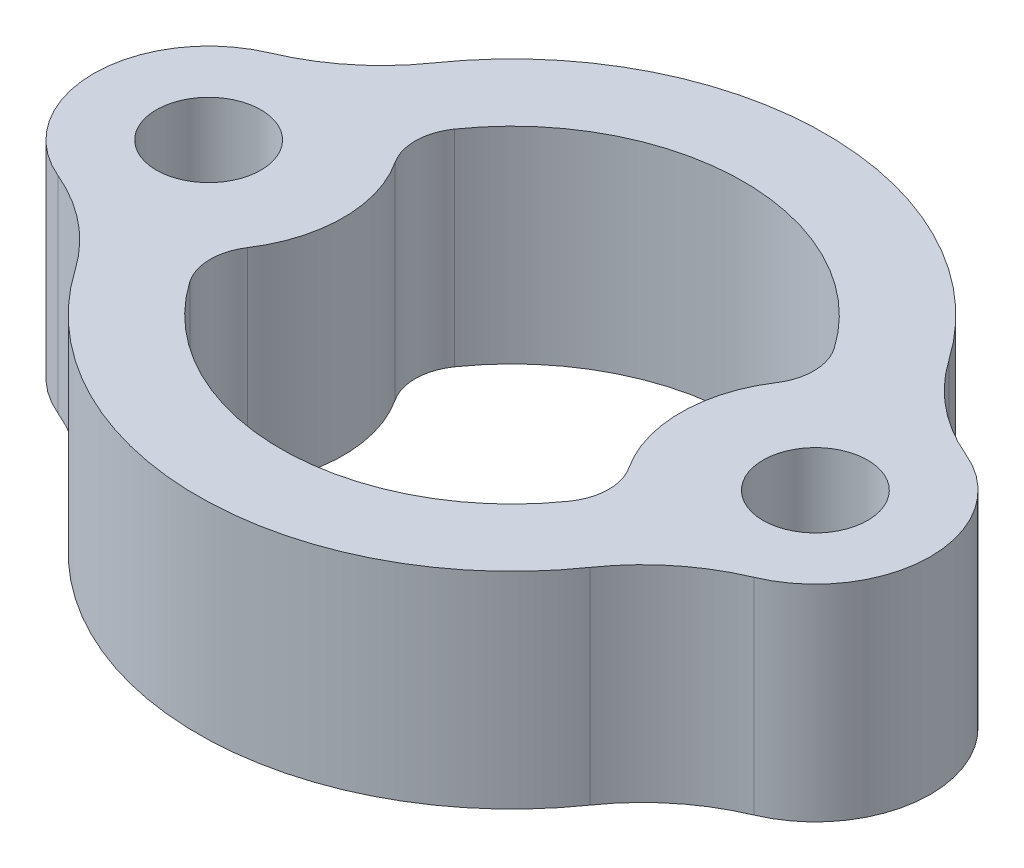
ISO-10303-21;
HEADER;
FILE_DESCRIPTION(('STEP AP214'),'2;1');
FILE_NAME('part.step','',(''),(''),'','','');
FILE_SCHEMA(('AUTOMOTIVE_DESIGN { 1 0 10303 214 1 1 1 1 }'));
ENDSEC;
DATA;
#1=APPLICATION_CONTEXT('core data for automotive mechanical design processes');
#2=APPLICATION_PROTOCOL_DEFINITION('international standard','automotive_design',2000,#1);
#3=PRODUCT_CONTEXT('',#1,'mechanical');
#4=PRODUCT('Part','Part','',(#3));
#5=PRODUCT_RELATED_PRODUCT_CATEGORY('part','',(#4));
#6=PRODUCT_DEFINITION_FORMATION('','',#4);
#7=PRODUCT_DEFINITION_CONTEXT('part definition',#1,'design');
#8=PRODUCT_DEFINITION('design','',#6,#7);
#9=PRODUCT_DEFINITION_SHAPE('','',#8);
#10=(LENGTH_UNIT() NAMED_UNIT(*) SI_UNIT(.MILLI.,.METRE.));
#11=(NAMED_UNIT(*) PLANE_ANGLE_UNIT() SI_UNIT($,.RADIAN.));
#12=(NAMED_UNIT(*) SI_UNIT($,.STERADIAN.) SOLID_ANGLE_UNIT());
#13=UNCERTAINTY_MEASURE_WITH_UNIT(LENGTH_MEASURE(1.E-05),#10,'distance_accuracy_value','');
#14=(GEOMETRIC_REPRESENTATION_CONTEXT(3) GLOBAL_UNCERTAINTY_ASSIGNED_CONTEXT((#13)) GLOBAL_UNIT_ASSIGNED_CONTEXT((#10,
#11,#12)) REPRESENTATION_CONTEXT('',''));
#15=CARTESIAN_POINT('',(0.,0.,0.));
#16=DIRECTION('',(0.,0.,1.));
#17=DIRECTION('',(1.,0.,0.));
#18=AXIS2_PLACEMENT_3D('',#15,#16,#17);
#19=CARTESIAN_POINT('',(3.683,2.5,0.));
#20=DIRECTION('',(0.,1.,0.));
#21=DIRECTION('',(0.,0.,1.));
#22=AXIS2_PLACEMENT_3D('',#19,#20,#21);
#23=PLANE('',#22);
#24=CARTESIAN_POINT('',(-7.366,2.5,0.));
#25=DIRECTION('',(0.,1.,0.));
#26=DIRECTION('',(0.,0.,1.));
#27=AXIS2_PLACEMENT_3D('',#24,#25,#26);
#28=CIRCLE('',#27,1.27);
#29=CARTESIAN_POINT('',(-7.366,2.5,1.27));
#30=VERTEX_POINT('',#29);
#31=EDGE_CURVE('E282',#30,#30,#28,.T.);
#32=ORIENTED_EDGE('',*,*,#31,.F.);
#33=EDGE_LOOP('',(#32));
#34=FACE_BOUND('',#33,.T.);
#35=CARTESIAN_POINT('',(-7.366,2.5,0.));
#36=DIRECTION('',(0.,1.,0.));
#37=DIRECTION('',(0.,0.,1.));
#38=AXIS2_PLACEMENT_3D('',#35,#36,#37);
#39=CIRCLE('',#38,2.794);
#40=CARTESIAN_POINT('',(-8.45065628476084,2.5,-2.57487023827004));
#41=VERTEX_POINT('',#40);
#42=CARTESIAN_POINT('',(-8.45065628476084,2.5,2.57487023827004));
#43=VERTEX_POINT('',#42);
#44=EDGE_CURVE('E191',#41,#43,#39,.T.);
#45=ORIENTED_EDGE('',*,*,#44,.T.);
#46=CARTESIAN_POINT('',(-10.4227586206897,2.5,7.2564524896701));
#47=DIRECTION('',(0.,1.,0.));
#48=DIRECTION('',(0.,0.,1.));
#49=AXIS2_PLACEMENT_3D('',#46,#47,#48);
#50=CIRCLE('',#49,5.08);
#51=CARTESIAN_POINT('',(-6.25365517241379,2.5,4.35387149380206));
#52=VERTEX_POINT('',#51);
#53=EDGE_CURVE('E211',#43,#52,#50,.F.);
#54=ORIENTED_EDGE('',*,*,#53,.T.);
#55=CARTESIAN_POINT('',(0.,2.5,0.));
#56=DIRECTION('',(0.,1.,0.));
#57=DIRECTION('',(0.,0.,1.));
#58=AXIS2_PLACEMENT_3D('',#55,#56,#57);
#59=CIRCLE('',#58,7.62);
#60=CARTESIAN_POINT('',(6.25365517241379,2.5,4.35387149380206));
#61=VERTEX_POINT('',#60);
#62=EDGE_CURVE('E185',#52,#61,#59,.T.);
#63=ORIENTED_EDGE('',*,*,#62,.T.);
#64=CARTESIAN_POINT('',(10.4227586206897,2.5,7.2564524896701));
#65=DIRECTION('',(0.,1.,0.));
#66=DIRECTION('',(0.,0.,1.));
#67=AXIS2_PLACEMENT_3D('',#64,#65,#66);
#68=CIRCLE('',#67,5.08);
#69=CARTESIAN_POINT('',(8.45065628476085,2.5,2.57487023827003));
#70=VERTEX_POINT('',#69);
#71=EDGE_CURVE('E215',#61,#70,#68,.F.);
#72=ORIENTED_EDGE('',*,*,#71,.T.);
#73=CARTESIAN_POINT('',(7.366,2.5,0.));
#74=DIRECTION('',(0.,1.,0.));
#75=DIRECTION('',(0.,0.,1.));
#76=AXIS2_PLACEMENT_3D('',#73,#74,#75);
#77=CIRCLE('',#76,2.794);
#78=CARTESIAN_POINT('',(8.45065628476084,2.5,-2.57487023827004));
#79=VERTEX_POINT('',#78);
#80=EDGE_CURVE('E295',#70,#79,#77,.T.);
#81=ORIENTED_EDGE('',*,*,#80,.T.);
#82=CARTESIAN_POINT('',(10.4227586206897,2.5,-7.25645248967011));
#83=DIRECTION('',(0.,1.,0.));
#84=DIRECTION('',(0.,0.,1.));
#85=AXIS2_PLACEMENT_3D('',#82,#83,#84);
#86=CIRCLE('',#85,5.08);
#87=CARTESIAN_POINT('',(6.25365517241379,2.5,-4.35387149380207));
#88=VERTEX_POINT('',#87);
#89=EDGE_CURVE('E162',#79,#88,#86,.F.);
#90=ORIENTED_EDGE('',*,*,#89,.T.);
#91=CARTESIAN_POINT('',(0.,2.5,0.));
#92=DIRECTION('',(0.,1.,0.));
#93=DIRECTION('',(0.,0.,1.));
#94=AXIS2_PLACEMENT_3D('',#91,#92,#93);
#95=CIRCLE('',#94,7.62);
#96=CARTESIAN_POINT('',(-6.25365517241379,2.5,-4.35387149380206));
#97=VERTEX_POINT('',#96);
#98=EDGE_CURVE('E172',#88,#97,#95,.T.);
#99=ORIENTED_EDGE('',*,*,#98,.T.);
#100=CARTESIAN_POINT('',(-10.4227586206897,2.5,-7.2564524896701));
#101=DIRECTION('',(0.,1.,0.));
#102=DIRECTION('',(0.,0.,1.));
#103=AXIS2_PLACEMENT_3D('',#100,#101,#102);
#104=CIRCLE('',#103,5.08);
#105=EDGE_CURVE('E207',#97,#41,#104,.F.);
#106=ORIENTED_EDGE('',*,*,#105,.T.);
#107=EDGE_LOOP('',(#45,#54,#63,#72,#81,#90,#99,#106));
#108=FACE_BOUND('',#107,.T.);
#109=CARTESIAN_POINT('',(7.366,2.5,0.));
#110=DIRECTION('',(0.,1.,0.));
#111=DIRECTION('',(0.,0.,1.));
#112=AXIS2_PLACEMENT_3D('',#109,#110,#111);
#113=CIRCLE('',#112,1.27);
#114=CARTESIAN_POINT('',(7.366,2.5,1.27));
#115=VERTEX_POINT('',#114);
#116=EDGE_CURVE('E288',#115,#115,#113,.T.);
#117=ORIENTED_EDGE('',*,*,#116,.F.);
#118=EDGE_LOOP('',(#117));
#119=FACE_BOUND('',#118,.T.);
#120=CARTESIAN_POINT('',(7.366,2.5,0.));
#121=DIRECTION('',(0.,-1.,0.));
#122=DIRECTION('',(0.,0.,1.));
#123=AXIS2_PLACEMENT_3D('',#120,#121,#122);
#124=CIRCLE('',#123,3.27);
#125=CARTESIAN_POINT('',(4.63068449035394,2.5,1.79191212471196));
#126=VERTEX_POINT('',#125);
#127=CARTESIAN_POINT('',(4.63068449035394,2.5,-1.79191212471196));
#128=VERTEX_POINT('',#127);
#129=EDGE_CURVE('E251',#126,#128,#124,.T.);
#130=ORIENTED_EDGE('',*,*,#129,.F.);
#131=CARTESIAN_POINT('',(3.56834482758621,2.5,2.48785353094565));
#132=DIRECTION('',(0.,1.,0.));
#133=DIRECTION('',(0.,0.,1.));
#134=AXIS2_PLACEMENT_3D('',#131,#132,#133);
#135=CIRCLE('',#134,1.27);
#136=CARTESIAN_POINT('',(4.61013745541023,2.5,3.2141923779114));
#137=VERTEX_POINT('',#136);
#138=EDGE_CURVE('E46',#126,#137,#135,.F.);
#139=ORIENTED_EDGE('',*,*,#138,.T.);
#140=CARTESIAN_POINT('',(0.,2.5,0.));
#141=DIRECTION('',(0.,1.,0.));
#142=DIRECTION('',(0.,0.,1.));
#143=AXIS2_PLACEMENT_3D('',#140,#141,#142);
#144=CIRCLE('',#143,5.62);
#145=CARTESIAN_POINT('',(-4.61013745541023,2.5,3.2141923779114));
#146=VERTEX_POINT('',#145);
#147=EDGE_CURVE('E249',#146,#137,#144,.T.);
#148=ORIENTED_EDGE('',*,*,#147,.F.);
#149=CARTESIAN_POINT('',(-3.56834482758621,2.5,2.48785353094566));
#150=DIRECTION('',(0.,1.,0.));
#151=DIRECTION('',(0.,0.,1.));
#152=AXIS2_PLACEMENT_3D('',#149,#150,#151);
#153=CIRCLE('',#152,1.27);
#154=CARTESIAN_POINT('',(-4.63068449035394,2.5,1.79191212471196));
#155=VERTEX_POINT('',#154);
#156=EDGE_CURVE('E244',#146,#155,#153,.F.);
#157=ORIENTED_EDGE('',*,*,#156,.T.);
#158=CARTESIAN_POINT('',(-7.366,2.5,0.));
#159=DIRECTION('',(0.,-1.,0.));
#160=DIRECTION('',(0.,0.,1.));
#161=AXIS2_PLACEMENT_3D('',#158,#159,#160);
#162=CIRCLE('',#161,3.27);
#163=CARTESIAN_POINT('',(-4.63068449035394,2.5,-1.79191212471196));
#164=VERTEX_POINT('',#163);
#165=EDGE_CURVE('E257',#164,#155,#162,.T.);
#166=ORIENTED_EDGE('',*,*,#165,.F.);
#167=CARTESIAN_POINT('',(-3.56834482758621,2.5,-2.48785353094565));
#168=DIRECTION('',(0.,1.,0.));
#169=DIRECTION('',(0.,0.,1.));
#170=AXIS2_PLACEMENT_3D('',#167,#168,#169);
#171=CIRCLE('',#170,1.27);
#172=CARTESIAN_POINT('',(-4.61013745541022,2.5,-3.2141923779114));
#173=VERTEX_POINT('',#172);
#174=EDGE_CURVE('E240',#164,#173,#171,.F.);
#175=ORIENTED_EDGE('',*,*,#174,.T.);
#176=CARTESIAN_POINT('',(0.,2.5,0.));
#177=DIRECTION('',(0.,1.,0.));
#178=DIRECTION('',(0.,0.,1.));
#179=AXIS2_PLACEMENT_3D('',#176,#177,#178);
#180=CIRCLE('',#179,5.62);
#181=CARTESIAN_POINT('',(4.61013745541022,2.5,-3.2141923779114));
#182=VERTEX_POINT('',#181);
#183=EDGE_CURVE('E277',#182,#173,#180,.T.);
#184=ORIENTED_EDGE('',*,*,#183,.F.);
#185=CARTESIAN_POINT('',(3.5683448275862,2.5,-2.48785353094566));
#186=DIRECTION('',(0.,1.,0.));
#187=DIRECTION('',(0.,0.,1.));
#188=AXIS2_PLACEMENT_3D('',#185,#186,#187);
#189=CIRCLE('',#188,1.27);
#190=EDGE_CURVE('E236',#182,#128,#189,.F.);
#191=ORIENTED_EDGE('',*,*,#190,.T.);
#192=EDGE_LOOP('',(#130,#139,#148,#157,#166,#175,#184,#191));
#193=FACE_BOUND('',#192,.T.);
#194=ADVANCED_FACE('F38',(#34,#108,#119,#193),#23,.T.);
#195=CARTESIAN_POINT('',(3.683,-2.5,0.));
#196=DIRECTION('',(0.,1.,0.));
#197=DIRECTION('',(0.,0.,1.));
#198=AXIS2_PLACEMENT_3D('',#195,#196,#197);
#199=PLANE('',#198);
#200=CARTESIAN_POINT('',(0.,-2.5,0.));
#201=DIRECTION('',(0.,1.,0.));
#202=DIRECTION('',(0.,0.,1.));
#203=AXIS2_PLACEMENT_3D('',#200,#201,#202);
#204=CIRCLE('',#203,7.62);
#205=CARTESIAN_POINT('',(-6.25365517241379,-2.5,4.35387149380206));
#206=VERTEX_POINT('',#205);
#207=CARTESIAN_POINT('',(6.25365517241379,-2.5,4.35387149380206));
#208=VERTEX_POINT('',#207);
#209=EDGE_CURVE('E187',#206,#208,#204,.T.);
#210=ORIENTED_EDGE('',*,*,#209,.F.);
#211=CARTESIAN_POINT('',(-10.4227586206897,-2.5,7.2564524896701));
#212=DIRECTION('',(0.,1.,0.));
#213=DIRECTION('',(0.,0.,1.));
#214=AXIS2_PLACEMENT_3D('',#211,#212,#213);
#215=CIRCLE('',#214,5.08);
#216=CARTESIAN_POINT('',(-8.45065628476084,-2.5,2.57487023827004));
#217=VERTEX_POINT('',#216);
#218=EDGE_CURVE('E209',#206,#217,#215,.T.);
#219=ORIENTED_EDGE('',*,*,#218,.T.);
#220=CARTESIAN_POINT('',(-7.366,-2.5,0.));
#221=DIRECTION('',(0.,1.,0.));
#222=DIRECTION('',(0.,0.,1.));
#223=AXIS2_PLACEMENT_3D('',#220,#221,#222);
#224=CIRCLE('',#223,2.794);
#225=CARTESIAN_POINT('',(-8.45065628476084,-2.5,-2.57487023827004));
#226=VERTEX_POINT('',#225);
#227=EDGE_CURVE('E181',#226,#217,#224,.T.);
#228=ORIENTED_EDGE('',*,*,#227,.F.);
#229=CARTESIAN_POINT('',(-10.4227586206897,-2.5,-7.2564524896701));
#230=DIRECTION('',(0.,1.,0.));
#231=DIRECTION('',(0.,0.,1.));
#232=AXIS2_PLACEMENT_3D('',#229,#230,#231);
#233=CIRCLE('',#232,5.08);
#234=CARTESIAN_POINT('',(-6.25365517241379,-2.5,-4.35387149380206));
#235=VERTEX_POINT('',#234);
#236=EDGE_CURVE('E180',#226,#235,#233,.T.);
#237=ORIENTED_EDGE('',*,*,#236,.T.);
#238=CARTESIAN_POINT('',(0.,-2.5,0.));
#239=DIRECTION('',(0.,1.,0.));
#240=DIRECTION('',(0.,0.,1.));
#241=AXIS2_PLACEMENT_3D('',#238,#239,#240);
#242=CIRCLE('',#241,7.62);
#243=CARTESIAN_POINT('',(6.25365517241379,-2.5,-4.35387149380207));
#244=VERTEX_POINT('',#243);
#245=EDGE_CURVE('E169',#244,#235,#242,.T.);
#246=ORIENTED_EDGE('',*,*,#245,.F.);
#247=CARTESIAN_POINT('',(10.4227586206897,-2.5,-7.25645248967011));
#248=DIRECTION('',(0.,1.,0.));
#249=DIRECTION('',(0.,0.,1.));
#250=AXIS2_PLACEMENT_3D('',#247,#248,#249);
#251=CIRCLE('',#250,5.08);
#252=CARTESIAN_POINT('',(8.45065628476084,-2.5,-2.57487023827004));
#253=VERTEX_POINT('',#252);
#254=EDGE_CURVE('E152',#244,#253,#251,.T.);
#255=ORIENTED_EDGE('',*,*,#254,.T.);
#256=CARTESIAN_POINT('',(7.366,-2.5,0.));
#257=DIRECTION('',(0.,1.,0.));
#258=DIRECTION('',(0.,0.,1.));
#259=AXIS2_PLACEMENT_3D('',#256,#257,#258);
#260=CIRCLE('',#259,2.794);
#261=CARTESIAN_POINT('',(8.45065628476085,-2.5,2.57487023827003));
#262=VERTEX_POINT('',#261);
#263=EDGE_CURVE('E182',#262,#253,#260,.T.);
#264=ORIENTED_EDGE('',*,*,#263,.F.);
#265=CARTESIAN_POINT('',(10.4227586206897,-2.5,7.2564524896701));
#266=DIRECTION('',(0.,1.,0.));
#267=DIRECTION('',(0.,0.,1.));
#268=AXIS2_PLACEMENT_3D('',#265,#266,#267);
#269=CIRCLE('',#268,5.08);
#270=EDGE_CURVE('E213',#262,#208,#269,.T.);
#271=ORIENTED_EDGE('',*,*,#270,.T.);
#272=EDGE_LOOP('',(#210,#219,#228,#237,#246,#255,#264,#271));
#273=FACE_BOUND('',#272,.T.);
#274=CARTESIAN_POINT('',(7.366,-2.5,0.));
#275=DIRECTION('',(0.,1.,0.));
#276=DIRECTION('',(0.,0.,1.));
#277=AXIS2_PLACEMENT_3D('',#274,#275,#276);
#278=CIRCLE('',#277,1.27);
#279=CARTESIAN_POINT('',(7.366,-2.5,1.27));
#280=VERTEX_POINT('',#279);
#281=EDGE_CURVE('E285',#280,#280,#278,.T.);
#282=ORIENTED_EDGE('',*,*,#281,.T.);
#283=EDGE_LOOP('',(#282));
#284=FACE_BOUND('',#283,.T.);
#285=CARTESIAN_POINT('',(-7.366,-2.5,0.));
#286=DIRECTION('',(0.,1.,0.));
#287=DIRECTION('',(0.,0.,1.));
#288=AXIS2_PLACEMENT_3D('',#285,#286,#287);
#289=CIRCLE('',#288,1.27);
#290=CARTESIAN_POINT('',(-7.366,-2.5,1.27));
#291=VERTEX_POINT('',#290);
#292=EDGE_CURVE('E275',#291,#291,#289,.T.);
#293=ORIENTED_EDGE('',*,*,#292,.T.);
#294=EDGE_LOOP('',(#293));
#295=FACE_BOUND('',#294,.T.);
#296=CARTESIAN_POINT('',(-7.366,-2.5,0.));
#297=DIRECTION('',(0.,-1.,0.));
#298=DIRECTION('',(0.,0.,1.));
#299=AXIS2_PLACEMENT_3D('',#296,#297,#298);
#300=CIRCLE('',#299,3.27);
#301=CARTESIAN_POINT('',(-4.63068449035394,-2.5,-1.79191212471196));
#302=VERTEX_POINT('',#301);
#303=CARTESIAN_POINT('',(-4.63068449035394,-2.5,1.79191212471196));
#304=VERTEX_POINT('',#303);
#305=EDGE_CURVE('E270',#302,#304,#300,.T.);
#306=ORIENTED_EDGE('',*,*,#305,.T.);
#307=CARTESIAN_POINT('',(-3.56834482758621,-2.5,2.48785353094566));
#308=DIRECTION('',(0.,1.,0.));
#309=DIRECTION('',(0.,0.,1.));
#310=AXIS2_PLACEMENT_3D('',#307,#308,#309);
#311=CIRCLE('',#310,1.27);
#312=CARTESIAN_POINT('',(-4.61013745541023,-2.5,3.2141923779114));
#313=VERTEX_POINT('',#312);
#314=EDGE_CURVE('E60',#304,#313,#311,.T.);
#315=ORIENTED_EDGE('',*,*,#314,.T.);
#316=CARTESIAN_POINT('',(0.,-2.5,0.));
#317=DIRECTION('',(0.,1.,0.));
#318=DIRECTION('',(0.,0.,1.));
#319=AXIS2_PLACEMENT_3D('',#316,#317,#318);
#320=CIRCLE('',#319,5.62);
#321=CARTESIAN_POINT('',(4.61013745541023,-2.5,3.2141923779114));
#322=VERTEX_POINT('',#321);
#323=EDGE_CURVE('E263',#313,#322,#320,.T.);
#324=ORIENTED_EDGE('',*,*,#323,.T.);
#325=CARTESIAN_POINT('',(3.56834482758621,-2.5,2.48785353094565));
#326=DIRECTION('',(0.,1.,0.));
#327=DIRECTION('',(0.,0.,1.));
#328=AXIS2_PLACEMENT_3D('',#325,#326,#327);
#329=CIRCLE('',#328,1.27);
#330=CARTESIAN_POINT('',(4.63068449035394,-2.5,1.79191212471196));
#331=VERTEX_POINT('',#330);
#332=EDGE_CURVE('E11',#322,#331,#329,.T.);
#333=ORIENTED_EDGE('',*,*,#332,.T.);
#334=CARTESIAN_POINT('',(7.366,-2.5,0.));
#335=DIRECTION('',(0.,-1.,0.));
#336=DIRECTION('',(0.,0.,1.));
#337=AXIS2_PLACEMENT_3D('',#334,#335,#336);
#338=CIRCLE('',#337,3.27);
#339=CARTESIAN_POINT('',(4.63068449035394,-2.5,-1.79191212471196));
#340=VERTEX_POINT('',#339);
#341=EDGE_CURVE('E256',#331,#340,#338,.T.);
#342=ORIENTED_EDGE('',*,*,#341,.T.);
#343=CARTESIAN_POINT('',(3.5683448275862,-2.5,-2.48785353094566));
#344=DIRECTION('',(0.,1.,0.));
#345=DIRECTION('',(0.,0.,1.));
#346=AXIS2_PLACEMENT_3D('',#343,#344,#345);
#347=CIRCLE('',#346,1.27);
#348=CARTESIAN_POINT('',(4.61013745541022,-2.5,-3.2141923779114));
#349=VERTEX_POINT('',#348);
#350=EDGE_CURVE('E238',#340,#349,#347,.T.);
#351=ORIENTED_EDGE('',*,*,#350,.T.);
#352=CARTESIAN_POINT('',(0.,-2.5,0.));
#353=DIRECTION('',(0.,1.,0.));
#354=DIRECTION('',(0.,0.,1.));
#355=AXIS2_PLACEMENT_3D('',#352,#353,#354);
#356=CIRCLE('',#355,5.62);
#357=CARTESIAN_POINT('',(-4.61013745541022,-2.5,-3.2141923779114));
#358=VERTEX_POINT('',#357);
#359=EDGE_CURVE('E267',#349,#358,#356,.T.);
#360=ORIENTED_EDGE('',*,*,#359,.T.);
#361=CARTESIAN_POINT('',(-3.56834482758621,-2.5,-2.48785353094565));
#362=DIRECTION('',(0.,1.,0.));
#363=DIRECTION('',(0.,0.,1.));
#364=AXIS2_PLACEMENT_3D('',#361,#362,#363);
#365=CIRCLE('',#364,1.27);
#366=EDGE_CURVE('E242',#358,#302,#365,.T.);
#367=ORIENTED_EDGE('',*,*,#366,.T.);
#368=EDGE_LOOP('',(#306,#315,#324,#333,#342,#351,#360,#367));
#369=FACE_BOUND('',#368,.T.);
#370=ADVANCED_FACE('F177',(#273,#284,#295,#369),#199,.F.);
#371=CARTESIAN_POINT('',(0.,2.5,0.));
#372=DIRECTION('',(0.,-1.,0.));
#373=DIRECTION('',(0.,0.,-1.));
#374=AXIS2_PLACEMENT_3D('',#371,#372,#373);
#375=CYLINDRICAL_SURFACE('',#374,7.62);
#376=ORIENTED_EDGE('',*,*,#62,.F.);
#377=DIRECTION('',(0.,-1.,0.));
#378=VECTOR('',#377,1.);
#379=CARTESIAN_POINT('',(-6.25365517241379,2.5,4.35387149380206));
#380=LINE('',#379,#378);
#381=EDGE_CURVE('E163',#52,#206,#380,.T.);
#382=ORIENTED_EDGE('',*,*,#381,.T.);
#383=ORIENTED_EDGE('',*,*,#209,.T.);
#384=DIRECTION('',(0.,-1.,0.));
#385=VECTOR('',#384,1.);
#386=CARTESIAN_POINT('',(6.25365517241379,2.5,4.35387149380206));
#387=LINE('',#386,#385);
#388=EDGE_CURVE('E201',#208,#61,#387,.F.);
#389=ORIENTED_EDGE('',*,*,#388,.T.);
#390=EDGE_LOOP('',(#376,#382,#383,#389));
#391=FACE_BOUND('',#390,.T.);
#392=ADVANCED_FACE('F304',(#391),#375,.T.);
#393=CARTESIAN_POINT('',(7.366,2.5,0.));
#394=DIRECTION('',(0.,-1.,0.));
#395=DIRECTION('',(0.,0.,-1.));
#396=AXIS2_PLACEMENT_3D('',#393,#394,#395);
#397=CYLINDRICAL_SURFACE('',#396,2.794);
#398=ORIENTED_EDGE('',*,*,#263,.T.);
#399=DIRECTION('',(0.,-1.,0.));
#400=VECTOR('',#399,1.);
#401=CARTESIAN_POINT('',(8.45065628476084,2.5,-2.57487023827004));
#402=LINE('',#401,#400);
#403=EDGE_CURVE('E157',#253,#79,#402,.F.);
#404=ORIENTED_EDGE('',*,*,#403,.T.);
#405=ORIENTED_EDGE('',*,*,#80,.F.);
#406=DIRECTION('',(0.,-1.,0.));
#407=VECTOR('',#406,1.);
#408=CARTESIAN_POINT('',(8.45065628476085,2.5,2.57487023827004));
#409=LINE('',#408,#407);
#410=EDGE_CURVE('E173',#70,#262,#409,.T.);
#411=ORIENTED_EDGE('',*,*,#410,.T.);
#412=EDGE_LOOP('',(#398,#404,#405,#411));
#413=FACE_BOUND('',#412,.T.);
#414=ADVANCED_FACE('F314',(#413),#397,.T.);
#415=CARTESIAN_POINT('',(0.,2.5,0.));
#416=DIRECTION('',(0.,-1.,0.));
#417=DIRECTION('',(0.,0.,-1.));
#418=AXIS2_PLACEMENT_3D('',#415,#416,#417);
#419=CYLINDRICAL_SURFACE('',#418,7.62);
#420=ORIENTED_EDGE('',*,*,#98,.F.);
#421=DIRECTION('',(0.,-1.,0.));
#422=VECTOR('',#421,1.);
#423=CARTESIAN_POINT('',(6.25365517241379,2.5,-4.35387149380206));
#424=LINE('',#423,#422);
#425=EDGE_CURVE('E156',#88,#244,#424,.T.);
#426=ORIENTED_EDGE('',*,*,#425,.T.);
#427=ORIENTED_EDGE('',*,*,#245,.T.);
#428=DIRECTION('',(0.,-1.,0.));
#429=VECTOR('',#428,1.);
#430=CARTESIAN_POINT('',(-6.25365517241379,2.5,-4.35387149380206));
#431=LINE('',#430,#429);
#432=EDGE_CURVE('E174',#235,#97,#431,.F.);
#433=ORIENTED_EDGE('',*,*,#432,.T.);
#434=EDGE_LOOP('',(#420,#426,#427,#433));
#435=FACE_BOUND('',#434,.T.);
#436=ADVANCED_FACE('F168',(#435),#419,.T.);
#437=CARTESIAN_POINT('',(-7.366,2.5,0.));
#438=DIRECTION('',(0.,-1.,0.));
#439=DIRECTION('',(0.,0.,-1.));
#440=AXIS2_PLACEMENT_3D('',#437,#438,#439);
#441=CYLINDRICAL_SURFACE('',#440,2.794);
#442=ORIENTED_EDGE('',*,*,#44,.F.);
#443=DIRECTION('',(0.,-1.,0.));
#444=VECTOR('',#443,1.);
#445=CARTESIAN_POINT('',(-8.45065628476084,2.5,-2.57487023827004));
#446=LINE('',#445,#444);
#447=EDGE_CURVE('E198',#41,#226,#446,.T.);
#448=ORIENTED_EDGE('',*,*,#447,.T.);
#449=ORIENTED_EDGE('',*,*,#227,.T.);
#450=DIRECTION('',(0.,-1.,0.));
#451=VECTOR('',#450,1.);
#452=CARTESIAN_POINT('',(-8.45065628476084,2.5,2.57487023827004));
#453=LINE('',#452,#451);
#454=EDGE_CURVE('E196',#217,#43,#453,.F.);
#455=ORIENTED_EDGE('',*,*,#454,.T.);
#456=EDGE_LOOP('',(#442,#448,#449,#455));
#457=FACE_BOUND('',#456,.T.);
#458=ADVANCED_FACE('F321',(#457),#441,.T.);
#459=CARTESIAN_POINT('',(7.366,2.5,0.));
#460=DIRECTION('',(0.,-1.,0.));
#461=DIRECTION('',(0.,0.,-1.));
#462=AXIS2_PLACEMENT_3D('',#459,#460,#461);
#463=CYLINDRICAL_SURFACE('',#462,1.27);
#464=ORIENTED_EDGE('',*,*,#116,.T.);
#465=EDGE_LOOP('',(#464));
#466=FACE_BOUND('',#465,.T.);
#467=ORIENTED_EDGE('',*,*,#281,.F.);
#468=EDGE_LOOP('',(#467));
#469=FACE_BOUND('',#468,.T.);
#470=ADVANCED_FACE('F333',(#466,#469),#463,.F.);
#471=CARTESIAN_POINT('',(-7.366,2.5,0.));
#472=DIRECTION('',(0.,-1.,0.));
#473=DIRECTION('',(0.,0.,-1.));
#474=AXIS2_PLACEMENT_3D('',#471,#472,#473);
#475=CYLINDRICAL_SURFACE('',#474,1.27);
#476=ORIENTED_EDGE('',*,*,#31,.T.);
#477=EDGE_LOOP('',(#476));
#478=FACE_BOUND('',#477,.T.);
#479=ORIENTED_EDGE('',*,*,#292,.F.);
#480=EDGE_LOOP('',(#479));
#481=FACE_BOUND('',#480,.T.);
#482=ADVANCED_FACE('F341',(#478,#481),#475,.F.);
#483=CARTESIAN_POINT('',(10.4227586206897,2.5,-7.25645248967011));
#484=DIRECTION('',(0.,1.,0.));
#485=DIRECTION('',(0.,0.,1.));
#486=AXIS2_PLACEMENT_3D('',#483,#484,#485);
#487=CYLINDRICAL_SURFACE('',#486,5.08);
#488=ORIENTED_EDGE('',*,*,#89,.F.);
#489=ORIENTED_EDGE('',*,*,#403,.F.);
#490=ORIENTED_EDGE('',*,*,#254,.F.);
#491=ORIENTED_EDGE('',*,*,#425,.F.);
#492=EDGE_LOOP('',(#488,#489,#490,#491));
#493=FACE_BOUND('',#492,.T.);
#494=ADVANCED_FACE('F155',(#493),#487,.F.);
#495=CARTESIAN_POINT('',(-10.4227586206897,2.5,-7.2564524896701));
#496=DIRECTION('',(0.,1.,0.));
#497=DIRECTION('',(0.,0.,1.));
#498=AXIS2_PLACEMENT_3D('',#495,#496,#497);
#499=CYLINDRICAL_SURFACE('',#498,5.08);
#500=ORIENTED_EDGE('',*,*,#105,.F.);
#501=ORIENTED_EDGE('',*,*,#432,.F.);
#502=ORIENTED_EDGE('',*,*,#236,.F.);
#503=ORIENTED_EDGE('',*,*,#447,.F.);
#504=EDGE_LOOP('',(#500,#501,#502,#503));
#505=FACE_BOUND('',#504,.T.);
#506=ADVANCED_FACE('F349',(#505),#499,.F.);
#507=CARTESIAN_POINT('',(-10.4227586206897,2.5,7.2564524896701));
#508=DIRECTION('',(0.,1.,0.));
#509=DIRECTION('',(0.,0.,1.));
#510=AXIS2_PLACEMENT_3D('',#507,#508,#509);
#511=CYLINDRICAL_SURFACE('',#510,5.08);
#512=ORIENTED_EDGE('',*,*,#53,.F.);
#513=ORIENTED_EDGE('',*,*,#454,.F.);
#514=ORIENTED_EDGE('',*,*,#218,.F.);
#515=ORIENTED_EDGE('',*,*,#381,.F.);
#516=EDGE_LOOP('',(#512,#513,#514,#515));
#517=FACE_BOUND('',#516,.T.);
#518=ADVANCED_FACE('F351',(#517),#511,.F.);
#519=CARTESIAN_POINT('',(10.4227586206897,2.5,7.2564524896701));
#520=DIRECTION('',(0.,1.,0.));
#521=DIRECTION('',(0.,0.,1.));
#522=AXIS2_PLACEMENT_3D('',#519,#520,#521);
#523=CYLINDRICAL_SURFACE('',#522,5.08);
#524=ORIENTED_EDGE('',*,*,#71,.F.);
#525=ORIENTED_EDGE('',*,*,#388,.F.);
#526=ORIENTED_EDGE('',*,*,#270,.F.);
#527=ORIENTED_EDGE('',*,*,#410,.F.);
#528=EDGE_LOOP('',(#524,#525,#526,#527));
#529=FACE_BOUND('',#528,.T.);
#530=ADVANCED_FACE('F308',(#529),#523,.F.);
#531=CARTESIAN_POINT('',(0.,-2.5,0.));
#532=DIRECTION('',(0.,1.,0.));
#533=DIRECTION('',(0.,0.,1.));
#534=AXIS2_PLACEMENT_3D('',#531,#532,#533);
#535=CYLINDRICAL_SURFACE('',#534,5.62);
#536=ORIENTED_EDGE('',*,*,#323,.F.);
#537=DIRECTION('',(0.,1.,0.));
#538=VECTOR('',#537,1.);
#539=CARTESIAN_POINT('',(-4.61013745541023,-2.5,3.2141923779114));
#540=LINE('',#539,#538);
#541=EDGE_CURVE('E233',#313,#146,#540,.T.);
#542=ORIENTED_EDGE('',*,*,#541,.T.);
#543=ORIENTED_EDGE('',*,*,#147,.T.);
#544=DIRECTION('',(0.,1.,0.));
#545=VECTOR('',#544,1.);
#546=CARTESIAN_POINT('',(4.61013745541023,-2.5,3.2141923779114));
#547=LINE('',#546,#545);
#548=EDGE_CURVE('E53',#137,#322,#547,.F.);
#549=ORIENTED_EDGE('',*,*,#548,.T.);
#550=EDGE_LOOP('',(#536,#542,#543,#549));
#551=FACE_BOUND('',#550,.T.);
#552=ADVANCED_FACE('F254',(#551),#535,.F.);
#553=CARTESIAN_POINT('',(-7.366,-2.5,0.));
#554=DIRECTION('',(0.,1.,0.));
#555=DIRECTION('',(0.,0.,1.));
#556=AXIS2_PLACEMENT_3D('',#553,#554,#555);
#557=CYLINDRICAL_SURFACE('',#556,3.27);
#558=ORIENTED_EDGE('',*,*,#305,.F.);
#559=DIRECTION('',(0.,1.,0.));
#560=VECTOR('',#559,1.);
#561=CARTESIAN_POINT('',(-4.63068449035394,-2.5,-1.79191212471196));
#562=LINE('',#561,#560);
#563=EDGE_CURVE('E229',#302,#164,#562,.T.);
#564=ORIENTED_EDGE('',*,*,#563,.T.);
#565=ORIENTED_EDGE('',*,*,#165,.T.);
#566=DIRECTION('',(0.,1.,0.));
#567=VECTOR('',#566,1.);
#568=CARTESIAN_POINT('',(-4.63068449035394,-2.5,1.79191212471196));
#569=LINE('',#568,#567);
#570=EDGE_CURVE('E227',#155,#304,#569,.F.);
#571=ORIENTED_EDGE('',*,*,#570,.T.);
#572=EDGE_LOOP('',(#558,#564,#565,#571));
#573=FACE_BOUND('',#572,.T.);
#574=ADVANCED_FACE('F380',(#573),#557,.T.);
#575=CARTESIAN_POINT('',(0.,-2.5,0.));
#576=DIRECTION('',(0.,1.,0.));
#577=DIRECTION('',(0.,0.,1.));
#578=AXIS2_PLACEMENT_3D('',#575,#576,#577);
#579=CYLINDRICAL_SURFACE('',#578,5.62);
#580=ORIENTED_EDGE('',*,*,#359,.F.);
#581=DIRECTION('',(0.,1.,0.));
#582=VECTOR('',#581,1.);
#583=CARTESIAN_POINT('',(4.61013745541022,-2.5,-3.2141923779114));
#584=LINE('',#583,#582);
#585=EDGE_CURVE('E219',#349,#182,#584,.T.);
#586=ORIENTED_EDGE('',*,*,#585,.T.);
#587=ORIENTED_EDGE('',*,*,#183,.T.);
#588=DIRECTION('',(0.,1.,0.));
#589=VECTOR('',#588,1.);
#590=CARTESIAN_POINT('',(-4.61013745541023,-2.5,-3.2141923779114));
#591=LINE('',#590,#589);
#592=EDGE_CURVE('E217',#173,#358,#591,.F.);
#593=ORIENTED_EDGE('',*,*,#592,.T.);
#594=EDGE_LOOP('',(#580,#586,#587,#593));
#595=FACE_BOUND('',#594,.T.);
#596=ADVANCED_FACE('F387',(#595),#579,.F.);
#597=CARTESIAN_POINT('',(7.366,-2.5,0.));
#598=DIRECTION('',(0.,1.,0.));
#599=DIRECTION('',(0.,0.,1.));
#600=AXIS2_PLACEMENT_3D('',#597,#598,#599);
#601=CYLINDRICAL_SURFACE('',#600,3.27);
#602=ORIENTED_EDGE('',*,*,#129,.T.);
#603=DIRECTION('',(0.,1.,0.));
#604=VECTOR('',#603,1.);
#605=CARTESIAN_POINT('',(4.63068449035394,-2.5,-1.79191212471196));
#606=LINE('',#605,#604);
#607=EDGE_CURVE('E225',#128,#340,#606,.F.);
#608=ORIENTED_EDGE('',*,*,#607,.T.);
#609=ORIENTED_EDGE('',*,*,#341,.F.);
#610=DIRECTION('',(0.,1.,0.));
#611=VECTOR('',#610,1.);
#612=CARTESIAN_POINT('',(4.63068449035394,-2.5,1.79191212471196));
#613=LINE('',#612,#611);
#614=EDGE_CURVE('E222',#331,#126,#613,.T.);
#615=ORIENTED_EDGE('',*,*,#614,.T.);
#616=EDGE_LOOP('',(#602,#608,#609,#615));
#617=FACE_BOUND('',#616,.T.);
#618=ADVANCED_FACE('F265',(#617),#601,.T.);
#619=CARTESIAN_POINT('',(3.5683448275862,-2.5,-2.48785353094566));
#620=DIRECTION('',(0.,1.,0.));
#621=DIRECTION('',(0.,0.,1.));
#622=AXIS2_PLACEMENT_3D('',#619,#620,#621);
#623=CYLINDRICAL_SURFACE('',#622,1.27);
#624=ORIENTED_EDGE('',*,*,#350,.F.);
#625=ORIENTED_EDGE('',*,*,#607,.F.);
#626=ORIENTED_EDGE('',*,*,#190,.F.);
#627=ORIENTED_EDGE('',*,*,#585,.F.);
#628=EDGE_LOOP('',(#624,#625,#626,#627));
#629=FACE_BOUND('',#628,.T.);
#630=ADVANCED_FACE('F363',(#629),#623,.F.);
#631=CARTESIAN_POINT('',(-3.56834482758621,-2.5,-2.48785353094565));
#632=DIRECTION('',(0.,1.,0.));
#633=DIRECTION('',(0.,0.,1.));
#634=AXIS2_PLACEMENT_3D('',#631,#632,#633);
#635=CYLINDRICAL_SURFACE('',#634,1.27);
#636=ORIENTED_EDGE('',*,*,#366,.F.);
#637=ORIENTED_EDGE('',*,*,#592,.F.);
#638=ORIENTED_EDGE('',*,*,#174,.F.);
#639=ORIENTED_EDGE('',*,*,#563,.F.);
#640=EDGE_LOOP('',(#636,#637,#638,#639));
#641=FACE_BOUND('',#640,.T.);
#642=ADVANCED_FACE('F366',(#641),#635,.F.);
#643=CARTESIAN_POINT('',(-3.56834482758621,-2.5,2.48785353094566));
#644=DIRECTION('',(0.,1.,0.));
#645=DIRECTION('',(0.,0.,1.));
#646=AXIS2_PLACEMENT_3D('',#643,#644,#645);
#647=CYLINDRICAL_SURFACE('',#646,1.27);
#648=ORIENTED_EDGE('',*,*,#314,.F.);
#649=ORIENTED_EDGE('',*,*,#570,.F.);
#650=ORIENTED_EDGE('',*,*,#156,.F.);
#651=ORIENTED_EDGE('',*,*,#541,.F.);
#652=EDGE_LOOP('',(#648,#649,#650,#651));
#653=FACE_BOUND('',#652,.T.);
#654=ADVANCED_FACE('F369',(#653),#647,.F.);
#655=CARTESIAN_POINT('',(3.56834482758621,-2.5,2.48785353094565));
#656=DIRECTION('',(0.,1.,0.));
#657=DIRECTION('',(0.,0.,1.));
#658=AXIS2_PLACEMENT_3D('',#655,#656,#657);
#659=CYLINDRICAL_SURFACE('',#658,1.27);
#660=ORIENTED_EDGE('',*,*,#332,.F.);
#661=ORIENTED_EDGE('',*,*,#548,.F.);
#662=ORIENTED_EDGE('',*,*,#138,.F.);
#663=ORIENTED_EDGE('',*,*,#614,.F.);
#664=EDGE_LOOP('',(#660,#661,#662,#663));
#665=FACE_BOUND('',#664,.T.);
#666=ADVANCED_FACE('F40',(#665),#659,.F.);
#667=CLOSED_SHELL('',(#194,#370,#392,#414,#436,#458,#470,#482,#494,#506,#518,#530,#552,#574,
#596,#618,#630,#642,#654,#666));
#668=MANIFOLD_SOLID_BREP('B2',#667);
#669=ADVANCED_BREP_SHAPE_REPRESENTATION('',(#18,#668),#14);
#670=SHAPE_DEFINITION_REPRESENTATION(#9,#669);
ENDSEC;
END-ISO-10303-21;
